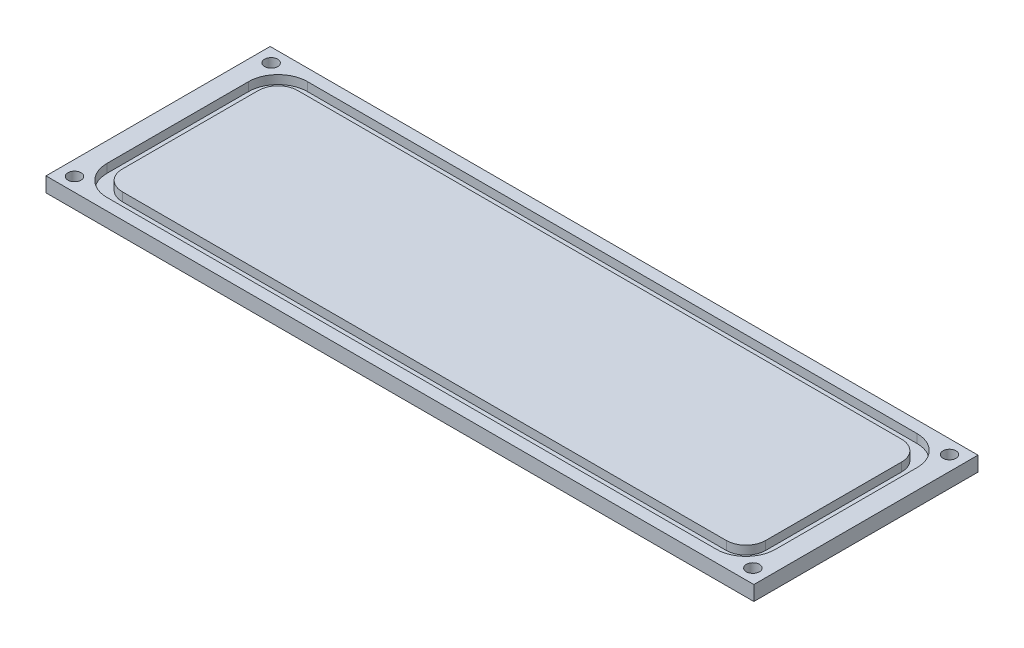
ISO-10303-21;
HEADER;
FILE_DESCRIPTION(('STEP AP214'),'2;1');
FILE_NAME('part.step','',(''),(''),'','','');
FILE_SCHEMA(('AUTOMOTIVE_DESIGN { 1 0 10303 214 1 1 1 1 }'));
ENDSEC;
DATA;
#1=APPLICATION_CONTEXT('core data for automotive mechanical design processes');
#2=APPLICATION_PROTOCOL_DEFINITION('international standard','automotive_design',2000,#1);
#3=PRODUCT_CONTEXT('',#1,'mechanical');
#4=PRODUCT('Part','Part','',(#3));
#5=PRODUCT_RELATED_PRODUCT_CATEGORY('part','',(#4));
#6=PRODUCT_DEFINITION_FORMATION('','',#4);
#7=PRODUCT_DEFINITION_CONTEXT('part definition',#1,'design');
#8=PRODUCT_DEFINITION('design','',#6,#7);
#9=PRODUCT_DEFINITION_SHAPE('','',#8);
#10=(LENGTH_UNIT() NAMED_UNIT(*) SI_UNIT(.MILLI.,.METRE.));
#11=(NAMED_UNIT(*) PLANE_ANGLE_UNIT() SI_UNIT($,.RADIAN.));
#12=(NAMED_UNIT(*) SI_UNIT($,.STERADIAN.) SOLID_ANGLE_UNIT());
#13=UNCERTAINTY_MEASURE_WITH_UNIT(LENGTH_MEASURE(1.E-05),#10,'distance_accuracy_value','');
#14=(GEOMETRIC_REPRESENTATION_CONTEXT(3) GLOBAL_UNCERTAINTY_ASSIGNED_CONTEXT((#13)) GLOBAL_UNIT_ASSIGNED_CONTEXT((#10,
#11,#12)) REPRESENTATION_CONTEXT('',''));
#15=CARTESIAN_POINT('',(0.,0.,0.));
#16=DIRECTION('',(0.,0.,1.));
#17=DIRECTION('',(1.,0.,0.));
#18=AXIS2_PLACEMENT_3D('',#15,#16,#17);
#19=CARTESIAN_POINT('',(0.,4.7625,0.));
#20=DIRECTION('',(0.,-1.,0.));
#21=DIRECTION('',(0.,0.,-1.));
#22=AXIS2_PLACEMENT_3D('',#19,#20,#21);
#23=PLANE('',#22);
#24=CARTESIAN_POINT('',(4.7625,4.7625,-67.945));
#25=DIRECTION('',(0.,1.,0.));
#26=DIRECTION('',(0.,0.,1.));
#27=AXIS2_PLACEMENT_3D('',#24,#25,#26);
#28=CIRCLE('',#27,2.1082);
#29=CARTESIAN_POINT('',(4.7625,4.7625,-65.8368));
#30=VERTEX_POINT('',#29);
#31=EDGE_CURVE('E482',#30,#30,#28,.T.);
#32=ORIENTED_EDGE('',*,*,#31,.F.);
#33=EDGE_LOOP('',(#32));
#34=FACE_BOUND('',#33,.T.);
#35=CARTESIAN_POINT('',(4.7625,4.7625,-4.445));
#36=DIRECTION('',(0.,1.,0.));
#37=DIRECTION('',(0.,0.,1.));
#38=AXIS2_PLACEMENT_3D('',#35,#36,#37);
#39=CIRCLE('',#38,2.1082);
#40=CARTESIAN_POINT('',(4.7625,4.7625,-2.3368));
#41=VERTEX_POINT('',#40);
#42=EDGE_CURVE('E471',#41,#41,#39,.T.);
#43=ORIENTED_EDGE('',*,*,#42,.F.);
#44=EDGE_LOOP('',(#43));
#45=FACE_BOUND('',#44,.T.);
#46=DIRECTION('',(1.,0.,0.));
#47=VECTOR('',#46,1.);
#48=CARTESIAN_POINT('',(6.35,4.7625,-3.81));
#49=LINE('',#48,#47);
#50=CARTESIAN_POINT('',(15.875,4.7625,-3.81));
#51=VERTEX_POINT('',#50);
#52=CARTESIAN_POINT('',(212.725,4.7625,-3.81));
#53=VERTEX_POINT('',#52);
#54=EDGE_CURVE('E322',#51,#53,#49,.T.);
#55=ORIENTED_EDGE('',*,*,#54,.F.);
#56=CARTESIAN_POINT('',(15.875,4.7625,-13.335));
#57=DIRECTION('',(0.,-1.,0.));
#58=DIRECTION('',(0.,0.,-1.));
#59=AXIS2_PLACEMENT_3D('',#56,#57,#58);
#60=CIRCLE('',#59,9.525);
#61=CARTESIAN_POINT('',(6.35,4.7625,-13.335));
#62=VERTEX_POINT('',#61);
#63=EDGE_CURVE('E234',#51,#62,#60,.T.);
#64=ORIENTED_EDGE('',*,*,#63,.T.);
#65=DIRECTION('',(0.,0.,1.));
#66=VECTOR('',#65,1.);
#67=CARTESIAN_POINT('',(6.35,4.7625,-3.81));
#68=LINE('',#67,#66);
#69=CARTESIAN_POINT('',(6.35,4.7625,-59.055));
#70=VERTEX_POINT('',#69);
#71=EDGE_CURVE('E319',#70,#62,#68,.T.);
#72=ORIENTED_EDGE('',*,*,#71,.F.);
#73=CARTESIAN_POINT('',(15.875,4.7625,-59.055));
#74=DIRECTION('',(0.,-1.,0.));
#75=DIRECTION('',(0.,0.,-1.));
#76=AXIS2_PLACEMENT_3D('',#73,#74,#75);
#77=CIRCLE('',#76,9.525);
#78=CARTESIAN_POINT('',(15.875,4.7625,-68.58));
#79=VERTEX_POINT('',#78);
#80=EDGE_CURVE('E240',#70,#79,#77,.T.);
#81=ORIENTED_EDGE('',*,*,#80,.T.);
#82=DIRECTION('',(-1.,0.,0.));
#83=VECTOR('',#82,1.);
#84=CARTESIAN_POINT('',(6.35,4.7625,-68.58));
#85=LINE('',#84,#83);
#86=CARTESIAN_POINT('',(212.725,4.7625,-68.58));
#87=VERTEX_POINT('',#86);
#88=EDGE_CURVE('E310',#87,#79,#85,.T.);
#89=ORIENTED_EDGE('',*,*,#88,.F.);
#90=CARTESIAN_POINT('',(212.725,4.7625,-59.055));
#91=DIRECTION('',(0.,-1.,0.));
#92=DIRECTION('',(0.,0.,-1.));
#93=AXIS2_PLACEMENT_3D('',#90,#91,#92);
#94=CIRCLE('',#93,9.525);
#95=CARTESIAN_POINT('',(222.25,4.7625,-59.055));
#96=VERTEX_POINT('',#95);
#97=EDGE_CURVE('E238',#87,#96,#94,.T.);
#98=ORIENTED_EDGE('',*,*,#97,.T.);
#99=DIRECTION('',(0.,0.,-1.));
#100=VECTOR('',#99,1.);
#101=CARTESIAN_POINT('',(222.25,4.7625,-3.81));
#102=LINE('',#101,#100);
#103=CARTESIAN_POINT('',(222.25,4.7625,-13.335));
#104=VERTEX_POINT('',#103);
#105=EDGE_CURVE('E325',#104,#96,#102,.T.);
#106=ORIENTED_EDGE('',*,*,#105,.F.);
#107=CARTESIAN_POINT('',(212.725,4.7625,-13.335));
#108=DIRECTION('',(0.,-1.,0.));
#109=DIRECTION('',(0.,0.,-1.));
#110=AXIS2_PLACEMENT_3D('',#107,#108,#109);
#111=CIRCLE('',#110,9.525);
#112=EDGE_CURVE('E236',#104,#53,#111,.T.);
#113=ORIENTED_EDGE('',*,*,#112,.T.);
#114=EDGE_LOOP('',(#55,#64,#72,#81,#89,#98,#106,#113));
#115=FACE_BOUND('',#114,.T.);
#116=DIRECTION('',(0.,0.,1.));
#117=VECTOR('',#116,1.);
#118=CARTESIAN_POINT('',(0.,4.7625,0.));
#119=LINE('',#118,#117);
#120=CARTESIAN_POINT('',(0.,4.7625,-72.39));
#121=VERTEX_POINT('',#120);
#122=CARTESIAN_POINT('',(0.,4.7625,0.));
#123=VERTEX_POINT('',#122);
#124=EDGE_CURVE('E187',#121,#123,#119,.T.);
#125=ORIENTED_EDGE('',*,*,#124,.T.);
#126=DIRECTION('',(1.,0.,0.));
#127=VECTOR('',#126,1.);
#128=CARTESIAN_POINT('',(0.,4.7625,0.));
#129=LINE('',#128,#127);
#130=CARTESIAN_POINT('',(228.6,4.7625,0.));
#131=VERTEX_POINT('',#130);
#132=EDGE_CURVE('E176',#123,#131,#129,.T.);
#133=ORIENTED_EDGE('',*,*,#132,.T.);
#134=DIRECTION('',(0.,0.,-1.));
#135=VECTOR('',#134,1.);
#136=CARTESIAN_POINT('',(228.6,4.7625,0.));
#137=LINE('',#136,#135);
#138=CARTESIAN_POINT('',(228.6,4.7625,-72.39));
#139=VERTEX_POINT('',#138);
#140=EDGE_CURVE('E186',#131,#139,#137,.T.);
#141=ORIENTED_EDGE('',*,*,#140,.T.);
#142=DIRECTION('',(-1.,0.,0.));
#143=VECTOR('',#142,1.);
#144=CARTESIAN_POINT('',(0.,4.7625,-72.39));
#145=LINE('',#144,#143);
#146=EDGE_CURVE('E192',#139,#121,#145,.T.);
#147=ORIENTED_EDGE('',*,*,#146,.T.);
#148=EDGE_LOOP('',(#125,#133,#141,#147));
#149=FACE_BOUND('',#148,.T.);
#150=CARTESIAN_POINT('',(223.8375,4.7625,-4.445));
#151=DIRECTION('',(0.,1.,0.));
#152=DIRECTION('',(0.,0.,1.));
#153=AXIS2_PLACEMENT_3D('',#150,#151,#152);
#154=CIRCLE('',#153,2.1082);
#155=CARTESIAN_POINT('',(223.8375,4.7625,-2.33679999999999));
#156=VERTEX_POINT('',#155);
#157=EDGE_CURVE('E488',#156,#156,#154,.T.);
#158=ORIENTED_EDGE('',*,*,#157,.F.);
#159=EDGE_LOOP('',(#158));
#160=FACE_BOUND('',#159,.T.);
#161=CARTESIAN_POINT('',(223.8375,4.7625,-67.945));
#162=DIRECTION('',(0.,1.,0.));
#163=DIRECTION('',(0.,0.,1.));
#164=AXIS2_PLACEMENT_3D('',#161,#162,#163);
#165=CIRCLE('',#164,2.1082);
#166=CARTESIAN_POINT('',(223.8375,4.7625,-65.8368));
#167=VERTEX_POINT('',#166);
#168=EDGE_CURVE('E494',#167,#167,#165,.T.);
#169=ORIENTED_EDGE('',*,*,#168,.F.);
#170=EDGE_LOOP('',(#169));
#171=FACE_BOUND('',#170,.T.);
#172=ADVANCED_FACE('F39',(#34,#45,#115,#149,#160,#171),#23,.F.);
#173=CARTESIAN_POINT('',(0.,0.,0.));
#174=DIRECTION('',(0.,-1.,0.));
#175=DIRECTION('',(0.,0.,-1.));
#176=AXIS2_PLACEMENT_3D('',#173,#174,#175);
#177=PLANE('',#176);
#178=CARTESIAN_POINT('',(223.8375,0.,-67.945));
#179=DIRECTION('',(0.,1.,0.));
#180=DIRECTION('',(0.,0.,1.));
#181=AXIS2_PLACEMENT_3D('',#178,#179,#180);
#182=CIRCLE('',#181,2.1082);
#183=CARTESIAN_POINT('',(223.8375,0.,-65.8368));
#184=VERTEX_POINT('',#183);
#185=EDGE_CURVE('E491',#184,#184,#182,.T.);
#186=ORIENTED_EDGE('',*,*,#185,.T.);
#187=EDGE_LOOP('',(#186));
#188=FACE_BOUND('',#187,.T.);
#189=CARTESIAN_POINT('',(223.8375,0.,-4.445));
#190=DIRECTION('',(0.,1.,0.));
#191=DIRECTION('',(0.,0.,1.));
#192=AXIS2_PLACEMENT_3D('',#189,#190,#191);
#193=CIRCLE('',#192,2.1082);
#194=CARTESIAN_POINT('',(223.8375,0.,-2.33679999999999));
#195=VERTEX_POINT('',#194);
#196=EDGE_CURVE('E485',#195,#195,#193,.T.);
#197=ORIENTED_EDGE('',*,*,#196,.T.);
#198=EDGE_LOOP('',(#197));
#199=FACE_BOUND('',#198,.T.);
#200=CARTESIAN_POINT('',(4.7625,0.,-67.945));
#201=DIRECTION('',(0.,1.,0.));
#202=DIRECTION('',(0.,0.,1.));
#203=AXIS2_PLACEMENT_3D('',#200,#201,#202);
#204=CIRCLE('',#203,2.1082);
#205=CARTESIAN_POINT('',(4.7625,0.,-65.8368));
#206=VERTEX_POINT('',#205);
#207=EDGE_CURVE('E479',#206,#206,#204,.T.);
#208=ORIENTED_EDGE('',*,*,#207,.T.);
#209=EDGE_LOOP('',(#208));
#210=FACE_BOUND('',#209,.T.);
#211=DIRECTION('',(0.,0.,1.));
#212=VECTOR('',#211,1.);
#213=CARTESIAN_POINT('',(0.,0.,0.));
#214=LINE('',#213,#212);
#215=CARTESIAN_POINT('',(0.,0.,-72.39));
#216=VERTEX_POINT('',#215);
#217=CARTESIAN_POINT('',(0.,0.,0.));
#218=VERTEX_POINT('',#217);
#219=EDGE_CURVE('E200',#216,#218,#214,.T.);
#220=ORIENTED_EDGE('',*,*,#219,.F.);
#221=DIRECTION('',(-1.,0.,0.));
#222=VECTOR('',#221,1.);
#223=CARTESIAN_POINT('',(0.,0.,-72.39));
#224=LINE('',#223,#222);
#225=CARTESIAN_POINT('',(228.6,0.,-72.39));
#226=VERTEX_POINT('',#225);
#227=EDGE_CURVE('E196',#226,#216,#224,.T.);
#228=ORIENTED_EDGE('',*,*,#227,.F.);
#229=DIRECTION('',(0.,0.,-1.));
#230=VECTOR('',#229,1.);
#231=CARTESIAN_POINT('',(228.6,0.,0.));
#232=LINE('',#231,#230);
#233=CARTESIAN_POINT('',(228.6,0.,0.));
#234=VERTEX_POINT('',#233);
#235=EDGE_CURVE('E336',#234,#226,#232,.T.);
#236=ORIENTED_EDGE('',*,*,#235,.F.);
#237=DIRECTION('',(1.,0.,0.));
#238=VECTOR('',#237,1.);
#239=CARTESIAN_POINT('',(0.,0.,0.));
#240=LINE('',#239,#238);
#241=EDGE_CURVE('E334',#218,#234,#240,.T.);
#242=ORIENTED_EDGE('',*,*,#241,.F.);
#243=EDGE_LOOP('',(#220,#228,#236,#242));
#244=FACE_BOUND('',#243,.T.);
#245=CARTESIAN_POINT('',(4.7625,0.,-4.445));
#246=DIRECTION('',(0.,1.,0.));
#247=DIRECTION('',(0.,0.,1.));
#248=AXIS2_PLACEMENT_3D('',#245,#246,#247);
#249=CIRCLE('',#248,2.1082);
#250=CARTESIAN_POINT('',(4.7625,0.,-2.3368));
#251=VERTEX_POINT('',#250);
#252=EDGE_CURVE('E467',#251,#251,#249,.T.);
#253=ORIENTED_EDGE('',*,*,#252,.T.);
#254=EDGE_LOOP('',(#253));
#255=FACE_BOUND('',#254,.T.);
#256=ADVANCED_FACE('F347',(#188,#199,#210,#244,#255),#177,.T.);
#257=CARTESIAN_POINT('',(0.,4.7625,0.));
#258=DIRECTION('',(1.,0.,0.));
#259=DIRECTION('',(0.,0.,-1.));
#260=AXIS2_PLACEMENT_3D('',#257,#258,#259);
#261=PLANE('',#260);
#262=ORIENTED_EDGE('',*,*,#219,.T.);
#263=DIRECTION('',(0.,-1.,0.));
#264=VECTOR('',#263,1.);
#265=CARTESIAN_POINT('',(0.,4.7625,0.));
#266=LINE('',#265,#264);
#267=EDGE_CURVE('E180',#123,#218,#266,.T.);
#268=ORIENTED_EDGE('',*,*,#267,.F.);
#269=ORIENTED_EDGE('',*,*,#124,.F.);
#270=DIRECTION('',(0.,-1.,0.));
#271=VECTOR('',#270,1.);
#272=CARTESIAN_POINT('',(0.,4.7625,-72.39));
#273=LINE('',#272,#271);
#274=EDGE_CURVE('E332',#121,#216,#273,.T.);
#275=ORIENTED_EDGE('',*,*,#274,.T.);
#276=EDGE_LOOP('',(#262,#268,#269,#275));
#277=FACE_BOUND('',#276,.T.);
#278=ADVANCED_FACE('F198',(#277),#261,.F.);
#279=CARTESIAN_POINT('',(0.,4.7625,0.));
#280=DIRECTION('',(0.,0.,-1.));
#281=DIRECTION('',(-1.,0.,0.));
#282=AXIS2_PLACEMENT_3D('',#279,#280,#281);
#283=PLANE('',#282);
#284=ORIENTED_EDGE('',*,*,#241,.T.);
#285=DIRECTION('',(0.,-1.,0.));
#286=VECTOR('',#285,1.);
#287=CARTESIAN_POINT('',(228.6,4.7625,0.));
#288=LINE('',#287,#286);
#289=EDGE_CURVE('E183',#131,#234,#288,.T.);
#290=ORIENTED_EDGE('',*,*,#289,.F.);
#291=ORIENTED_EDGE('',*,*,#132,.F.);
#292=ORIENTED_EDGE('',*,*,#267,.T.);
#293=EDGE_LOOP('',(#284,#290,#291,#292));
#294=FACE_BOUND('',#293,.T.);
#295=ADVANCED_FACE('F178',(#294),#283,.F.);
#296=CARTESIAN_POINT('',(228.6,4.7625,0.));
#297=DIRECTION('',(-1.,0.,0.));
#298=DIRECTION('',(0.,0.,1.));
#299=AXIS2_PLACEMENT_3D('',#296,#297,#298);
#300=PLANE('',#299);
#301=ORIENTED_EDGE('',*,*,#235,.T.);
#302=DIRECTION('',(0.,-1.,0.));
#303=VECTOR('',#302,1.);
#304=CARTESIAN_POINT('',(228.6,4.7625,-72.39));
#305=LINE('',#304,#303);
#306=EDGE_CURVE('E205',#139,#226,#305,.T.);
#307=ORIENTED_EDGE('',*,*,#306,.F.);
#308=ORIENTED_EDGE('',*,*,#140,.F.);
#309=ORIENTED_EDGE('',*,*,#289,.T.);
#310=EDGE_LOOP('',(#301,#307,#308,#309));
#311=FACE_BOUND('',#310,.T.);
#312=ADVANCED_FACE('F349',(#311),#300,.F.);
#313=CARTESIAN_POINT('',(0.,4.7625,-72.39));
#314=DIRECTION('',(0.,0.,1.));
#315=DIRECTION('',(1.,0.,0.));
#316=AXIS2_PLACEMENT_3D('',#313,#314,#315);
#317=PLANE('',#316);
#318=ORIENTED_EDGE('',*,*,#227,.T.);
#319=ORIENTED_EDGE('',*,*,#274,.F.);
#320=ORIENTED_EDGE('',*,*,#146,.F.);
#321=ORIENTED_EDGE('',*,*,#306,.T.);
#322=EDGE_LOOP('',(#318,#319,#320,#321));
#323=FACE_BOUND('',#322,.T.);
#324=ADVANCED_FACE('F343',(#323),#317,.F.);
#325=CARTESIAN_POINT('',(6.35,1.9685,-3.81));
#326=DIRECTION('',(-1.,0.,0.));
#327=DIRECTION('',(0.,0.,1.));
#328=AXIS2_PLACEMENT_3D('',#325,#326,#327);
#329=PLANE('',#328);
#330=ORIENTED_EDGE('',*,*,#71,.T.);
#331=DIRECTION('',(0.,1.,0.));
#332=VECTOR('',#331,1.);
#333=CARTESIAN_POINT('',(6.35,1.9685,-13.335));
#334=LINE('',#333,#332);
#335=CARTESIAN_POINT('',(6.35,1.9685,-13.335));
#336=VERTEX_POINT('',#335);
#337=EDGE_CURVE('E214',#62,#336,#334,.F.);
#338=ORIENTED_EDGE('',*,*,#337,.T.);
#339=DIRECTION('',(0.,0.,1.));
#340=VECTOR('',#339,1.);
#341=CARTESIAN_POINT('',(6.35,1.9685,-3.81));
#342=LINE('',#341,#340);
#343=CARTESIAN_POINT('',(6.35,1.9685,-59.055));
#344=VERTEX_POINT('',#343);
#345=EDGE_CURVE('E306',#344,#336,#342,.T.);
#346=ORIENTED_EDGE('',*,*,#345,.F.);
#347=DIRECTION('',(0.,1.,0.));
#348=VECTOR('',#347,1.);
#349=CARTESIAN_POINT('',(6.35,4.7625,-59.055));
#350=LINE('',#349,#348);
#351=EDGE_CURVE('E211',#344,#70,#350,.T.);
#352=ORIENTED_EDGE('',*,*,#351,.T.);
#353=EDGE_LOOP('',(#330,#338,#346,#352));
#354=FACE_BOUND('',#353,.T.);
#355=ADVANCED_FACE('F356',(#354),#329,.F.);
#356=CARTESIAN_POINT('',(6.35,1.9685,-68.58));
#357=DIRECTION('',(0.,0.,-1.));
#358=DIRECTION('',(-1.,0.,0.));
#359=AXIS2_PLACEMENT_3D('',#356,#357,#358);
#360=PLANE('',#359);
#361=DIRECTION('',(-1.,0.,0.));
#362=VECTOR('',#361,1.);
#363=CARTESIAN_POINT('',(6.35,1.9685,-68.58));
#364=LINE('',#363,#362);
#365=CARTESIAN_POINT('',(212.725,1.9685,-68.58));
#366=VERTEX_POINT('',#365);
#367=CARTESIAN_POINT('',(15.875,1.9685,-68.58));
#368=VERTEX_POINT('',#367);
#369=EDGE_CURVE('E316',#366,#368,#364,.T.);
#370=ORIENTED_EDGE('',*,*,#369,.F.);
#371=DIRECTION('',(0.,1.,0.));
#372=VECTOR('',#371,1.);
#373=CARTESIAN_POINT('',(212.725,4.7625,-68.58));
#374=LINE('',#373,#372);
#375=EDGE_CURVE('E231',#366,#87,#374,.T.);
#376=ORIENTED_EDGE('',*,*,#375,.T.);
#377=ORIENTED_EDGE('',*,*,#88,.T.);
#378=DIRECTION('',(0.,1.,0.));
#379=VECTOR('',#378,1.);
#380=CARTESIAN_POINT('',(15.875,1.9685,-68.58));
#381=LINE('',#380,#379);
#382=EDGE_CURVE('E229',#79,#368,#381,.F.);
#383=ORIENTED_EDGE('',*,*,#382,.T.);
#384=EDGE_LOOP('',(#370,#376,#377,#383));
#385=FACE_BOUND('',#384,.T.);
#386=ADVANCED_FACE('F398',(#385),#360,.F.);
#387=CARTESIAN_POINT('',(222.25,1.9685,-3.81));
#388=DIRECTION('',(1.,0.,0.));
#389=DIRECTION('',(0.,0.,-1.));
#390=AXIS2_PLACEMENT_3D('',#387,#388,#389);
#391=PLANE('',#390);
#392=DIRECTION('',(0.,0.,-1.));
#393=VECTOR('',#392,1.);
#394=CARTESIAN_POINT('',(222.25,1.9685,-3.81));
#395=LINE('',#394,#393);
#396=CARTESIAN_POINT('',(222.25,1.9685,-13.335));
#397=VERTEX_POINT('',#396);
#398=CARTESIAN_POINT('',(222.25,1.9685,-59.055));
#399=VERTEX_POINT('',#398);
#400=EDGE_CURVE('E313',#397,#399,#395,.T.);
#401=ORIENTED_EDGE('',*,*,#400,.F.);
#402=DIRECTION('',(0.,1.,0.));
#403=VECTOR('',#402,1.);
#404=CARTESIAN_POINT('',(222.25,4.7625,-13.335));
#405=LINE('',#404,#403);
#406=EDGE_CURVE('E226',#397,#104,#405,.T.);
#407=ORIENTED_EDGE('',*,*,#406,.T.);
#408=ORIENTED_EDGE('',*,*,#105,.T.);
#409=DIRECTION('',(0.,1.,0.));
#410=VECTOR('',#409,1.);
#411=CARTESIAN_POINT('',(222.25,1.9685,-59.055));
#412=LINE('',#411,#410);
#413=EDGE_CURVE('E224',#96,#399,#412,.F.);
#414=ORIENTED_EDGE('',*,*,#413,.T.);
#415=EDGE_LOOP('',(#401,#407,#408,#414));
#416=FACE_BOUND('',#415,.T.);
#417=ADVANCED_FACE('F401',(#416),#391,.F.);
#418=CARTESIAN_POINT('',(6.35,1.9685,-3.81));
#419=DIRECTION('',(0.,0.,1.));
#420=DIRECTION('',(1.,0.,0.));
#421=AXIS2_PLACEMENT_3D('',#418,#419,#420);
#422=PLANE('',#421);
#423=DIRECTION('',(1.,0.,0.));
#424=VECTOR('',#423,1.);
#425=CARTESIAN_POINT('',(6.35,1.9685,-3.81));
#426=LINE('',#425,#424);
#427=CARTESIAN_POINT('',(15.875,1.9685,-3.81));
#428=VERTEX_POINT('',#427);
#429=CARTESIAN_POINT('',(212.725,1.9685,-3.81));
#430=VERTEX_POINT('',#429);
#431=EDGE_CURVE('E309',#428,#430,#426,.T.);
#432=ORIENTED_EDGE('',*,*,#431,.F.);
#433=DIRECTION('',(0.,1.,0.));
#434=VECTOR('',#433,1.);
#435=CARTESIAN_POINT('',(15.875,4.7625,-3.81));
#436=LINE('',#435,#434);
#437=EDGE_CURVE('E203',#428,#51,#436,.T.);
#438=ORIENTED_EDGE('',*,*,#437,.T.);
#439=ORIENTED_EDGE('',*,*,#54,.T.);
#440=DIRECTION('',(0.,1.,0.));
#441=VECTOR('',#440,1.);
#442=CARTESIAN_POINT('',(212.725,1.9685,-3.81));
#443=LINE('',#442,#441);
#444=EDGE_CURVE('E201',#53,#430,#443,.F.);
#445=ORIENTED_EDGE('',*,*,#444,.T.);
#446=EDGE_LOOP('',(#432,#438,#439,#445));
#447=FACE_BOUND('',#446,.T.);
#448=ADVANCED_FACE('F397',(#447),#422,.F.);
#449=CARTESIAN_POINT('',(0.,1.9685,0.));
#450=DIRECTION('',(0.,-1.,0.));
#451=DIRECTION('',(0.,0.,-1.));
#452=AXIS2_PLACEMENT_3D('',#449,#450,#451);
#453=PLANE('',#452);
#454=DIRECTION('',(0.,0.,1.));
#455=VECTOR('',#454,1.);
#456=CARTESIAN_POINT('',(10.414,1.9685,-7.874));
#457=LINE('',#456,#455);
#458=CARTESIAN_POINT('',(10.414,1.9685,-58.166));
#459=VERTEX_POINT('',#458);
#460=CARTESIAN_POINT('',(10.414,1.9685,-14.224));
#461=VERTEX_POINT('',#460);
#462=EDGE_CURVE('E298',#459,#461,#457,.T.);
#463=ORIENTED_EDGE('',*,*,#462,.F.);
#464=CARTESIAN_POINT('',(16.764,1.9685,-58.166));
#465=DIRECTION('',(0.,-1.,0.));
#466=DIRECTION('',(0.,0.,-1.));
#467=AXIS2_PLACEMENT_3D('',#464,#465,#466);
#468=CIRCLE('',#467,6.35);
#469=CARTESIAN_POINT('',(16.764,1.9685,-64.516));
#470=VERTEX_POINT('',#469);
#471=EDGE_CURVE('E11',#459,#470,#468,.T.);
#472=ORIENTED_EDGE('',*,*,#471,.T.);
#473=DIRECTION('',(-1.,0.,0.));
#474=VECTOR('',#473,1.);
#475=CARTESIAN_POINT('',(10.414,1.9685,-64.516));
#476=LINE('',#475,#474);
#477=CARTESIAN_POINT('',(211.836,1.9685,-64.516));
#478=VERTEX_POINT('',#477);
#479=EDGE_CURVE('E279',#478,#470,#476,.T.);
#480=ORIENTED_EDGE('',*,*,#479,.F.);
#481=CARTESIAN_POINT('',(211.836,1.9685,-58.166));
#482=DIRECTION('',(0.,-1.,0.));
#483=DIRECTION('',(0.,0.,-1.));
#484=AXIS2_PLACEMENT_3D('',#481,#482,#483);
#485=CIRCLE('',#484,6.35);
#486=CARTESIAN_POINT('',(218.186,1.9685,-58.166));
#487=VERTEX_POINT('',#486);
#488=EDGE_CURVE('E47',#478,#487,#485,.T.);
#489=ORIENTED_EDGE('',*,*,#488,.T.);
#490=DIRECTION('',(0.,0.,-1.));
#491=VECTOR('',#490,1.);
#492=CARTESIAN_POINT('',(218.186,1.9685,-7.874));
#493=LINE('',#492,#491);
#494=CARTESIAN_POINT('',(218.186,1.9685,-14.224));
#495=VERTEX_POINT('',#494);
#496=EDGE_CURVE('E277',#495,#487,#493,.T.);
#497=ORIENTED_EDGE('',*,*,#496,.F.);
#498=CARTESIAN_POINT('',(211.836,1.9685,-14.224));
#499=DIRECTION('',(0.,-1.,0.));
#500=DIRECTION('',(0.,0.,-1.));
#501=AXIS2_PLACEMENT_3D('',#498,#499,#500);
#502=CIRCLE('',#501,6.35);
#503=CARTESIAN_POINT('',(211.836,1.9685,-7.874));
#504=VERTEX_POINT('',#503);
#505=EDGE_CURVE('E271',#495,#504,#502,.T.);
#506=ORIENTED_EDGE('',*,*,#505,.T.);
#507=DIRECTION('',(1.,0.,0.));
#508=VECTOR('',#507,1.);
#509=CARTESIAN_POINT('',(10.414,1.9685,-7.874));
#510=LINE('',#509,#508);
#511=CARTESIAN_POINT('',(16.764,1.9685,-7.874));
#512=VERTEX_POINT('',#511);
#513=EDGE_CURVE('E287',#512,#504,#510,.T.);
#514=ORIENTED_EDGE('',*,*,#513,.F.);
#515=CARTESIAN_POINT('',(16.764,1.9685,-14.224));
#516=DIRECTION('',(0.,-1.,0.));
#517=DIRECTION('',(0.,0.,-1.));
#518=AXIS2_PLACEMENT_3D('',#515,#516,#517);
#519=CIRCLE('',#518,6.35);
#520=EDGE_CURVE('E269',#512,#461,#519,.T.);
#521=ORIENTED_EDGE('',*,*,#520,.T.);
#522=EDGE_LOOP('',(#463,#472,#480,#489,#497,#506,#514,#521));
#523=FACE_BOUND('',#522,.T.);
#524=ORIENTED_EDGE('',*,*,#345,.T.);
#525=CARTESIAN_POINT('',(15.875,1.9685,-13.335));
#526=DIRECTION('',(0.,-1.,0.));
#527=DIRECTION('',(0.,0.,-1.));
#528=AXIS2_PLACEMENT_3D('',#525,#526,#527);
#529=CIRCLE('',#528,9.525);
#530=EDGE_CURVE('E222',#336,#428,#529,.F.);
#531=ORIENTED_EDGE('',*,*,#530,.T.);
#532=ORIENTED_EDGE('',*,*,#431,.T.);
#533=CARTESIAN_POINT('',(212.725,1.9685,-13.335));
#534=DIRECTION('',(0.,-1.,0.));
#535=DIRECTION('',(0.,0.,-1.));
#536=AXIS2_PLACEMENT_3D('',#533,#534,#535);
#537=CIRCLE('',#536,9.525);
#538=EDGE_CURVE('E220',#430,#397,#537,.F.);
#539=ORIENTED_EDGE('',*,*,#538,.T.);
#540=ORIENTED_EDGE('',*,*,#400,.T.);
#541=CARTESIAN_POINT('',(212.725,1.9685,-59.055));
#542=DIRECTION('',(0.,-1.,0.));
#543=DIRECTION('',(0.,0.,-1.));
#544=AXIS2_PLACEMENT_3D('',#541,#542,#543);
#545=CIRCLE('',#544,9.525);
#546=EDGE_CURVE('E218',#399,#366,#545,.F.);
#547=ORIENTED_EDGE('',*,*,#546,.T.);
#548=ORIENTED_EDGE('',*,*,#369,.T.);
#549=CARTESIAN_POINT('',(15.875,1.9685,-59.055));
#550=DIRECTION('',(0.,-1.,0.));
#551=DIRECTION('',(0.,0.,-1.));
#552=AXIS2_PLACEMENT_3D('',#549,#550,#551);
#553=CIRCLE('',#552,9.525);
#554=EDGE_CURVE('E216',#368,#344,#553,.F.);
#555=ORIENTED_EDGE('',*,*,#554,.T.);
#556=EDGE_LOOP('',(#524,#531,#532,#539,#540,#547,#548,#555));
#557=FACE_BOUND('',#556,.T.);
#558=ADVANCED_FACE('F275',(#523,#557),#453,.F.);
#559=CARTESIAN_POINT('',(10.414,1.9685,-7.874));
#560=DIRECTION('',(-1.,0.,0.));
#561=DIRECTION('',(0.,0.,1.));
#562=AXIS2_PLACEMENT_3D('',#559,#560,#561);
#563=PLANE('',#562);
#564=ORIENTED_EDGE('',*,*,#462,.T.);
#565=DIRECTION('',(0.,1.,0.));
#566=VECTOR('',#565,1.);
#567=CARTESIAN_POINT('',(10.414,1.9685,-14.224));
#568=LINE('',#567,#566);
#569=CARTESIAN_POINT('',(10.414,4.7625,-14.224));
#570=VERTEX_POINT('',#569);
#571=EDGE_CURVE('E244',#461,#570,#568,.T.);
#572=ORIENTED_EDGE('',*,*,#571,.T.);
#573=DIRECTION('',(0.,0.,1.));
#574=VECTOR('',#573,1.);
#575=CARTESIAN_POINT('',(10.414,4.7625,-7.874));
#576=LINE('',#575,#574);
#577=CARTESIAN_POINT('',(10.414,4.7625,-58.166));
#578=VERTEX_POINT('',#577);
#579=EDGE_CURVE('E465',#578,#570,#576,.T.);
#580=ORIENTED_EDGE('',*,*,#579,.F.);
#581=DIRECTION('',(0.,1.,0.));
#582=VECTOR('',#581,1.);
#583=CARTESIAN_POINT('',(10.414,1.9685,-58.166));
#584=LINE('',#583,#582);
#585=EDGE_CURVE('E242',#578,#459,#584,.F.);
#586=ORIENTED_EDGE('',*,*,#585,.T.);
#587=EDGE_LOOP('',(#564,#572,#580,#586));
#588=FACE_BOUND('',#587,.T.);
#589=ADVANCED_FACE('F391',(#588),#563,.T.);
#590=CARTESIAN_POINT('',(10.414,1.9685,-64.516));
#591=DIRECTION('',(0.,0.,-1.));
#592=DIRECTION('',(-1.,0.,0.));
#593=AXIS2_PLACEMENT_3D('',#590,#591,#592);
#594=PLANE('',#593);
#595=DIRECTION('',(-1.,0.,0.));
#596=VECTOR('',#595,1.);
#597=CARTESIAN_POINT('',(10.414,4.7625,-64.516));
#598=LINE('',#597,#596);
#599=CARTESIAN_POINT('',(211.836,4.7625,-64.516));
#600=VERTEX_POINT('',#599);
#601=CARTESIAN_POINT('',(16.764,4.7625,-64.516));
#602=VERTEX_POINT('',#601);
#603=EDGE_CURVE('E294',#600,#602,#598,.T.);
#604=ORIENTED_EDGE('',*,*,#603,.F.);
#605=DIRECTION('',(0.,1.,0.));
#606=VECTOR('',#605,1.);
#607=CARTESIAN_POINT('',(211.836,1.9685,-64.516));
#608=LINE('',#607,#606);
#609=EDGE_CURVE('E59',#600,#478,#608,.F.);
#610=ORIENTED_EDGE('',*,*,#609,.T.);
#611=ORIENTED_EDGE('',*,*,#479,.T.);
#612=DIRECTION('',(0.,1.,0.));
#613=VECTOR('',#612,1.);
#614=CARTESIAN_POINT('',(16.764,1.9685,-64.516));
#615=LINE('',#614,#613);
#616=EDGE_CURVE('E265',#470,#602,#615,.T.);
#617=ORIENTED_EDGE('',*,*,#616,.T.);
#618=EDGE_LOOP('',(#604,#610,#611,#617));
#619=FACE_BOUND('',#618,.T.);
#620=ADVANCED_FACE('F296',(#619),#594,.T.);
#621=CARTESIAN_POINT('',(218.186,1.9685,-7.874));
#622=DIRECTION('',(1.,0.,0.));
#623=DIRECTION('',(0.,0.,-1.));
#624=AXIS2_PLACEMENT_3D('',#621,#622,#623);
#625=PLANE('',#624);
#626=DIRECTION('',(0.,0.,-1.));
#627=VECTOR('',#626,1.);
#628=CARTESIAN_POINT('',(218.186,4.7625,-7.874));
#629=LINE('',#628,#627);
#630=CARTESIAN_POINT('',(218.186,4.7625,-14.224));
#631=VERTEX_POINT('',#630);
#632=CARTESIAN_POINT('',(218.186,4.7625,-58.166));
#633=VERTEX_POINT('',#632);
#634=EDGE_CURVE('E295',#631,#633,#629,.T.);
#635=ORIENTED_EDGE('',*,*,#634,.F.);
#636=DIRECTION('',(0.,1.,0.));
#637=VECTOR('',#636,1.);
#638=CARTESIAN_POINT('',(218.186,1.9685,-14.224));
#639=LINE('',#638,#637);
#640=EDGE_CURVE('E263',#631,#495,#639,.F.);
#641=ORIENTED_EDGE('',*,*,#640,.T.);
#642=ORIENTED_EDGE('',*,*,#496,.T.);
#643=DIRECTION('',(0.,1.,0.));
#644=VECTOR('',#643,1.);
#645=CARTESIAN_POINT('',(218.186,1.9685,-58.166));
#646=LINE('',#645,#644);
#647=EDGE_CURVE('E260',#487,#633,#646,.T.);
#648=ORIENTED_EDGE('',*,*,#647,.T.);
#649=EDGE_LOOP('',(#635,#641,#642,#648));
#650=FACE_BOUND('',#649,.T.);
#651=ADVANCED_FACE('F284',(#650),#625,.T.);
#652=CARTESIAN_POINT('',(10.414,1.9685,-7.874));
#653=DIRECTION('',(0.,0.,1.));
#654=DIRECTION('',(1.,0.,0.));
#655=AXIS2_PLACEMENT_3D('',#652,#653,#654);
#656=PLANE('',#655);
#657=DIRECTION('',(1.,0.,0.));
#658=VECTOR('',#657,1.);
#659=CARTESIAN_POINT('',(10.414,4.7625,-7.874));
#660=LINE('',#659,#658);
#661=CARTESIAN_POINT('',(16.764,4.7625,-7.874));
#662=VERTEX_POINT('',#661);
#663=CARTESIAN_POINT('',(211.836,4.7625,-7.874));
#664=VERTEX_POINT('',#663);
#665=EDGE_CURVE('E302',#662,#664,#660,.T.);
#666=ORIENTED_EDGE('',*,*,#665,.F.);
#667=DIRECTION('',(0.,1.,0.));
#668=VECTOR('',#667,1.);
#669=CARTESIAN_POINT('',(16.764,1.9685,-7.874));
#670=LINE('',#669,#668);
#671=EDGE_CURVE('E258',#662,#512,#670,.F.);
#672=ORIENTED_EDGE('',*,*,#671,.T.);
#673=ORIENTED_EDGE('',*,*,#513,.T.);
#674=DIRECTION('',(0.,1.,0.));
#675=VECTOR('',#674,1.);
#676=CARTESIAN_POINT('',(211.836,1.9685,-7.874));
#677=LINE('',#676,#675);
#678=EDGE_CURVE('E255',#504,#664,#677,.T.);
#679=ORIENTED_EDGE('',*,*,#678,.T.);
#680=EDGE_LOOP('',(#666,#672,#673,#679));
#681=FACE_BOUND('',#680,.T.);
#682=ADVANCED_FACE('F373',(#681),#656,.T.);
#683=ORIENTED_EDGE('',*,*,#579,.T.);
#684=CARTESIAN_POINT('',(16.764,4.7625,-14.224));
#685=DIRECTION('',(0.,-1.,0.));
#686=DIRECTION('',(0.,0.,-1.));
#687=AXIS2_PLACEMENT_3D('',#684,#685,#686);
#688=CIRCLE('',#687,6.35);
#689=EDGE_CURVE('E253',#570,#662,#688,.F.);
#690=ORIENTED_EDGE('',*,*,#689,.T.);
#691=ORIENTED_EDGE('',*,*,#665,.T.);
#692=CARTESIAN_POINT('',(211.836,4.7625,-14.224));
#693=DIRECTION('',(0.,-1.,0.));
#694=DIRECTION('',(0.,0.,-1.));
#695=AXIS2_PLACEMENT_3D('',#692,#693,#694);
#696=CIRCLE('',#695,6.35);
#697=EDGE_CURVE('E251',#664,#631,#696,.F.);
#698=ORIENTED_EDGE('',*,*,#697,.T.);
#699=ORIENTED_EDGE('',*,*,#634,.T.);
#700=CARTESIAN_POINT('',(211.836,4.7625,-58.166));
#701=DIRECTION('',(0.,-1.,0.));
#702=DIRECTION('',(0.,0.,-1.));
#703=AXIS2_PLACEMENT_3D('',#700,#701,#702);
#704=CIRCLE('',#703,6.35);
#705=EDGE_CURVE('E249',#633,#600,#704,.F.);
#706=ORIENTED_EDGE('',*,*,#705,.T.);
#707=ORIENTED_EDGE('',*,*,#603,.T.);
#708=CARTESIAN_POINT('',(16.764,4.7625,-58.166));
#709=DIRECTION('',(0.,-1.,0.));
#710=DIRECTION('',(0.,0.,-1.));
#711=AXIS2_PLACEMENT_3D('',#708,#709,#710);
#712=CIRCLE('',#711,6.35);
#713=EDGE_CURVE('E247',#602,#578,#712,.F.);
#714=ORIENTED_EDGE('',*,*,#713,.T.);
#715=EDGE_LOOP('',(#683,#690,#691,#698,#699,#706,#707,#714));
#716=FACE_BOUND('',#715,.T.);
#717=ADVANCED_FACE('F293',(#716),#23,.F.);
#718=CARTESIAN_POINT('',(15.875,1.9685,-13.335));
#719=DIRECTION('',(0.,-1.,0.));
#720=DIRECTION('',(0.,0.,-1.));
#721=AXIS2_PLACEMENT_3D('',#718,#719,#720);
#722=CYLINDRICAL_SURFACE('',#721,9.525);
#723=ORIENTED_EDGE('',*,*,#530,.F.);
#724=ORIENTED_EDGE('',*,*,#337,.F.);
#725=ORIENTED_EDGE('',*,*,#63,.F.);
#726=ORIENTED_EDGE('',*,*,#437,.F.);
#727=EDGE_LOOP('',(#723,#724,#725,#726));
#728=FACE_BOUND('',#727,.T.);
#729=ADVANCED_FACE('F372',(#728),#722,.F.);
#730=CARTESIAN_POINT('',(212.725,1.9685,-13.335));
#731=DIRECTION('',(0.,-1.,0.));
#732=DIRECTION('',(0.,0.,-1.));
#733=AXIS2_PLACEMENT_3D('',#730,#731,#732);
#734=CYLINDRICAL_SURFACE('',#733,9.525);
#735=ORIENTED_EDGE('',*,*,#538,.F.);
#736=ORIENTED_EDGE('',*,*,#444,.F.);
#737=ORIENTED_EDGE('',*,*,#112,.F.);
#738=ORIENTED_EDGE('',*,*,#406,.F.);
#739=EDGE_LOOP('',(#735,#736,#737,#738));
#740=FACE_BOUND('',#739,.T.);
#741=ADVANCED_FACE('F379',(#740),#734,.F.);
#742=CARTESIAN_POINT('',(212.725,1.9685,-59.055));
#743=DIRECTION('',(0.,-1.,0.));
#744=DIRECTION('',(0.,0.,-1.));
#745=AXIS2_PLACEMENT_3D('',#742,#743,#744);
#746=CYLINDRICAL_SURFACE('',#745,9.525);
#747=ORIENTED_EDGE('',*,*,#546,.F.);
#748=ORIENTED_EDGE('',*,*,#413,.F.);
#749=ORIENTED_EDGE('',*,*,#97,.F.);
#750=ORIENTED_EDGE('',*,*,#375,.F.);
#751=EDGE_LOOP('',(#747,#748,#749,#750));
#752=FACE_BOUND('',#751,.T.);
#753=ADVANCED_FACE('F430',(#752),#746,.F.);
#754=CARTESIAN_POINT('',(15.875,1.9685,-59.055));
#755=DIRECTION('',(0.,-1.,0.));
#756=DIRECTION('',(0.,0.,-1.));
#757=AXIS2_PLACEMENT_3D('',#754,#755,#756);
#758=CYLINDRICAL_SURFACE('',#757,9.525);
#759=ORIENTED_EDGE('',*,*,#554,.F.);
#760=ORIENTED_EDGE('',*,*,#382,.F.);
#761=ORIENTED_EDGE('',*,*,#80,.F.);
#762=ORIENTED_EDGE('',*,*,#351,.F.);
#763=EDGE_LOOP('',(#759,#760,#761,#762));
#764=FACE_BOUND('',#763,.T.);
#765=ADVANCED_FACE('F437',(#764),#758,.F.);
#766=CARTESIAN_POINT('',(16.764,1.9685,-14.224));
#767=DIRECTION('',(0.,1.,0.));
#768=DIRECTION('',(0.,0.,1.));
#769=AXIS2_PLACEMENT_3D('',#766,#767,#768);
#770=CYLINDRICAL_SURFACE('',#769,6.35);
#771=ORIENTED_EDGE('',*,*,#520,.F.);
#772=ORIENTED_EDGE('',*,*,#671,.F.);
#773=ORIENTED_EDGE('',*,*,#689,.F.);
#774=ORIENTED_EDGE('',*,*,#571,.F.);
#775=EDGE_LOOP('',(#771,#772,#773,#774));
#776=FACE_BOUND('',#775,.T.);
#777=ADVANCED_FACE('F439',(#776),#770,.T.);
#778=CARTESIAN_POINT('',(211.836,1.9685,-14.224));
#779=DIRECTION('',(0.,1.,0.));
#780=DIRECTION('',(0.,0.,1.));
#781=AXIS2_PLACEMENT_3D('',#778,#779,#780);
#782=CYLINDRICAL_SURFACE('',#781,6.35);
#783=ORIENTED_EDGE('',*,*,#505,.F.);
#784=ORIENTED_EDGE('',*,*,#640,.F.);
#785=ORIENTED_EDGE('',*,*,#697,.F.);
#786=ORIENTED_EDGE('',*,*,#678,.F.);
#787=EDGE_LOOP('',(#783,#784,#785,#786));
#788=FACE_BOUND('',#787,.T.);
#789=ADVANCED_FACE('F444',(#788),#782,.T.);
#790=CARTESIAN_POINT('',(211.836,1.9685,-58.166));
#791=DIRECTION('',(0.,1.,0.));
#792=DIRECTION('',(0.,0.,1.));
#793=AXIS2_PLACEMENT_3D('',#790,#791,#792);
#794=CYLINDRICAL_SURFACE('',#793,6.35);
#795=ORIENTED_EDGE('',*,*,#488,.F.);
#796=ORIENTED_EDGE('',*,*,#609,.F.);
#797=ORIENTED_EDGE('',*,*,#705,.F.);
#798=ORIENTED_EDGE('',*,*,#647,.F.);
#799=EDGE_LOOP('',(#795,#796,#797,#798));
#800=FACE_BOUND('',#799,.T.);
#801=ADVANCED_FACE('F289',(#800),#794,.T.);
#802=CARTESIAN_POINT('',(16.764,1.9685,-58.166));
#803=DIRECTION('',(0.,1.,0.));
#804=DIRECTION('',(0.,0.,1.));
#805=AXIS2_PLACEMENT_3D('',#802,#803,#804);
#806=CYLINDRICAL_SURFACE('',#805,6.35);
#807=ORIENTED_EDGE('',*,*,#471,.F.);
#808=ORIENTED_EDGE('',*,*,#585,.F.);
#809=ORIENTED_EDGE('',*,*,#713,.F.);
#810=ORIENTED_EDGE('',*,*,#616,.F.);
#811=EDGE_LOOP('',(#807,#808,#809,#810));
#812=FACE_BOUND('',#811,.T.);
#813=ADVANCED_FACE('F41',(#812),#806,.T.);
#814=CARTESIAN_POINT('',(4.7625,4.7625,-4.445));
#815=DIRECTION('',(0.,1.,0.));
#816=DIRECTION('',(0.,0.,1.));
#817=AXIS2_PLACEMENT_3D('',#814,#815,#816);
#818=CYLINDRICAL_SURFACE('',#817,2.1082);
#819=ORIENTED_EDGE('',*,*,#252,.F.);
#820=EDGE_LOOP('',(#819));
#821=FACE_BOUND('',#820,.T.);
#822=ORIENTED_EDGE('',*,*,#42,.T.);
#823=EDGE_LOOP('',(#822));
#824=FACE_BOUND('',#823,.T.);
#825=ADVANCED_FACE('F456',(#821,#824),#818,.F.);
#826=CARTESIAN_POINT('',(4.7625,4.7625,-67.945));
#827=DIRECTION('',(0.,1.,0.));
#828=DIRECTION('',(0.,0.,1.));
#829=AXIS2_PLACEMENT_3D('',#826,#827,#828);
#830=CYLINDRICAL_SURFACE('',#829,2.1082);
#831=ORIENTED_EDGE('',*,*,#207,.F.);
#832=EDGE_LOOP('',(#831));
#833=FACE_BOUND('',#832,.T.);
#834=ORIENTED_EDGE('',*,*,#31,.T.);
#835=EDGE_LOOP('',(#834));
#836=FACE_BOUND('',#835,.T.);
#837=ADVANCED_FACE('F460',(#833,#836),#830,.F.);
#838=CARTESIAN_POINT('',(223.8375,4.7625,-4.445));
#839=DIRECTION('',(0.,1.,0.));
#840=DIRECTION('',(0.,0.,1.));
#841=AXIS2_PLACEMENT_3D('',#838,#839,#840);
#842=CYLINDRICAL_SURFACE('',#841,2.1082);
#843=ORIENTED_EDGE('',*,*,#196,.F.);
#844=EDGE_LOOP('',(#843));
#845=FACE_BOUND('',#844,.T.);
#846=ORIENTED_EDGE('',*,*,#157,.T.);
#847=EDGE_LOOP('',(#846));
#848=FACE_BOUND('',#847,.T.);
#849=ADVANCED_FACE('F501',(#845,#848),#842,.F.);
#850=CARTESIAN_POINT('',(223.8375,4.7625,-67.945));
#851=DIRECTION('',(0.,1.,0.));
#852=DIRECTION('',(0.,0.,1.));
#853=AXIS2_PLACEMENT_3D('',#850,#851,#852);
#854=CYLINDRICAL_SURFACE('',#853,2.1082);
#855=ORIENTED_EDGE('',*,*,#185,.F.);
#856=EDGE_LOOP('',(#855));
#857=FACE_BOUND('',#856,.T.);
#858=ORIENTED_EDGE('',*,*,#168,.T.);
#859=EDGE_LOOP('',(#858));
#860=FACE_BOUND('',#859,.T.);
#861=ADVANCED_FACE('F498',(#857,#860),#854,.F.);
#862=CLOSED_SHELL('',(#172,#256,#278,#295,#312,#324,#355,#386,#417,#448,#558,#589,#620,#651,
#682,#717,#729,#741,#753,#765,#777,#789,#801,#813,#825,#837,#849,#861));
#863=MANIFOLD_SOLID_BREP('B2',#862);
#864=ADVANCED_BREP_SHAPE_REPRESENTATION('',(#18,#863),#14);
#865=SHAPE_DEFINITION_REPRESENTATION(#9,#864);
ENDSEC;
END-ISO-10303-21;
